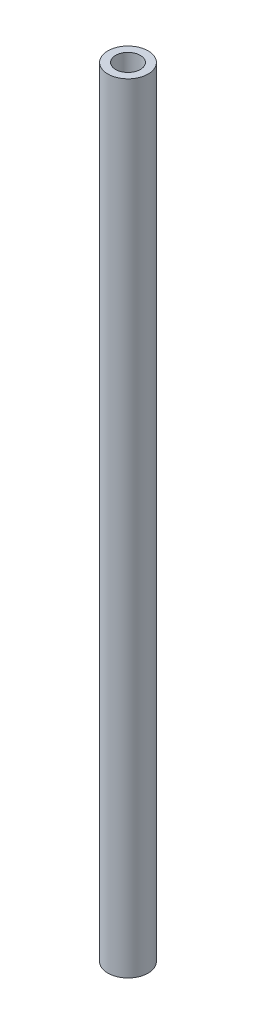
ISO-10303-21;
HEADER;
FILE_DESCRIPTION(('STEP AP214'),'2;1');
FILE_NAME('part.step','',(''),(''),'','','');
FILE_SCHEMA(('AUTOMOTIVE_DESIGN { 1 0 10303 214 1 1 1 1 }'));
ENDSEC;
DATA;
#1=APPLICATION_CONTEXT('core data for automotive mechanical design processes');
#2=APPLICATION_PROTOCOL_DEFINITION('international standard','automotive_design',2000,#1);
#3=PRODUCT_CONTEXT('',#1,'mechanical');
#4=PRODUCT('Part','Part','',(#3));
#5=PRODUCT_RELATED_PRODUCT_CATEGORY('part','',(#4));
#6=PRODUCT_DEFINITION_FORMATION('','',#4);
#7=PRODUCT_DEFINITION_CONTEXT('part definition',#1,'design');
#8=PRODUCT_DEFINITION('design','',#6,#7);
#9=PRODUCT_DEFINITION_SHAPE('','',#8);
#10=(LENGTH_UNIT() NAMED_UNIT(*) SI_UNIT(.MILLI.,.METRE.));
#11=(NAMED_UNIT(*) PLANE_ANGLE_UNIT() SI_UNIT($,.RADIAN.));
#12=(NAMED_UNIT(*) SI_UNIT($,.STERADIAN.) SOLID_ANGLE_UNIT());
#13=UNCERTAINTY_MEASURE_WITH_UNIT(LENGTH_MEASURE(1.E-05),#10,'distance_accuracy_value','');
#14=(GEOMETRIC_REPRESENTATION_CONTEXT(3) GLOBAL_UNCERTAINTY_ASSIGNED_CONTEXT((#13)) GLOBAL_UNIT_ASSIGNED_CONTEXT((#10,
#11,#12)) REPRESENTATION_CONTEXT('',''));
#15=CARTESIAN_POINT('',(0.,0.,0.));
#16=DIRECTION('',(0.,0.,1.));
#17=DIRECTION('',(1.,0.,0.));
#18=AXIS2_PLACEMENT_3D('',#15,#16,#17);
#19=CARTESIAN_POINT('',(0.,60.,0.));
#20=DIRECTION('',(0.,1.,0.));
#21=DIRECTION('',(0.,0.,1.));
#22=AXIS2_PLACEMENT_3D('',#19,#20,#21);
#23=PLANE('',#22);
#24=CARTESIAN_POINT('',(0.,60.,0.));
#25=DIRECTION('',(0.,1.,0.));
#26=DIRECTION('',(0.,0.,1.));
#27=AXIS2_PLACEMENT_3D('',#24,#25,#26);
#28=CIRCLE('',#27,1.55);
#29=CARTESIAN_POINT('',(0.,60.,1.55));
#30=VERTEX_POINT('',#29);
#31=EDGE_CURVE('E10',#30,#30,#28,.T.);
#32=ORIENTED_EDGE('',*,*,#31,.T.);
#33=EDGE_LOOP('',(#32));
#34=FACE_BOUND('',#33,.T.);
#35=CARTESIAN_POINT('',(0.,60.,0.));
#36=DIRECTION('',(0.,1.,0.));
#37=DIRECTION('',(0.,0.,1.));
#38=AXIS2_PLACEMENT_3D('',#35,#36,#37);
#39=CIRCLE('',#38,0.95);
#40=CARTESIAN_POINT('',(0.,60.,0.95));
#41=VERTEX_POINT('',#40);
#42=EDGE_CURVE('E50',#41,#41,#39,.T.);
#43=ORIENTED_EDGE('',*,*,#42,.F.);
#44=EDGE_LOOP('',(#43));
#45=FACE_BOUND('',#44,.T.);
#46=ADVANCED_FACE('F37',(#34,#45),#23,.T.);
#47=CARTESIAN_POINT('',(0.,0.,0.));
#48=DIRECTION('',(0.,1.,0.));
#49=DIRECTION('',(0.,0.,1.));
#50=AXIS2_PLACEMENT_3D('',#47,#48,#49);
#51=PLANE('',#50);
#52=CARTESIAN_POINT('',(0.,0.,0.));
#53=DIRECTION('',(0.,1.,0.));
#54=DIRECTION('',(0.,0.,1.));
#55=AXIS2_PLACEMENT_3D('',#52,#53,#54);
#56=CIRCLE('',#55,1.55);
#57=CARTESIAN_POINT('',(0.,0.,1.55));
#58=VERTEX_POINT('',#57);
#59=EDGE_CURVE('E41',#58,#58,#56,.T.);
#60=ORIENTED_EDGE('',*,*,#59,.F.);
#61=EDGE_LOOP('',(#60));
#62=FACE_BOUND('',#61,.T.);
#63=CARTESIAN_POINT('',(0.,0.,0.));
#64=DIRECTION('',(0.,1.,0.));
#65=DIRECTION('',(0.,0.,1.));
#66=AXIS2_PLACEMENT_3D('',#63,#64,#65);
#67=CIRCLE('',#66,0.95);
#68=CARTESIAN_POINT('',(0.,0.,0.95));
#69=VERTEX_POINT('',#68);
#70=EDGE_CURVE('E52',#69,#69,#67,.T.);
#71=ORIENTED_EDGE('',*,*,#70,.T.);
#72=EDGE_LOOP('',(#71));
#73=FACE_BOUND('',#72,.T.);
#74=ADVANCED_FACE('F64',(#62,#73),#51,.F.);
#75=CARTESIAN_POINT('',(0.,60.,0.));
#76=DIRECTION('',(0.,-1.,0.));
#77=DIRECTION('',(0.,0.,-1.));
#78=AXIS2_PLACEMENT_3D('',#75,#76,#77);
#79=CYLINDRICAL_SURFACE('',#78,1.55);
#80=ORIENTED_EDGE('',*,*,#31,.F.);
#81=EDGE_LOOP('',(#80));
#82=FACE_BOUND('',#81,.T.);
#83=ORIENTED_EDGE('',*,*,#59,.T.);
#84=EDGE_LOOP('',(#83));
#85=FACE_BOUND('',#84,.T.);
#86=ADVANCED_FACE('F39',(#82,#85),#79,.T.);
#87=CARTESIAN_POINT('',(0.,60.,0.));
#88=DIRECTION('',(0.,-1.,0.));
#89=DIRECTION('',(0.,0.,-1.));
#90=AXIS2_PLACEMENT_3D('',#87,#88,#89);
#91=CYLINDRICAL_SURFACE('',#90,0.95);
#92=ORIENTED_EDGE('',*,*,#42,.T.);
#93=EDGE_LOOP('',(#92));
#94=FACE_BOUND('',#93,.T.);
#95=ORIENTED_EDGE('',*,*,#70,.F.);
#96=EDGE_LOOP('',(#95));
#97=FACE_BOUND('',#96,.T.);
#98=ADVANCED_FACE('F60',(#94,#97),#91,.F.);
#99=CLOSED_SHELL('',(#46,#74,#86,#98));
#100=MANIFOLD_SOLID_BREP('B2',#99);
#101=ADVANCED_BREP_SHAPE_REPRESENTATION('',(#18,#100),#14);
#102=SHAPE_DEFINITION_REPRESENTATION(#9,#101);
ENDSEC;
END-ISO-10303-21;
